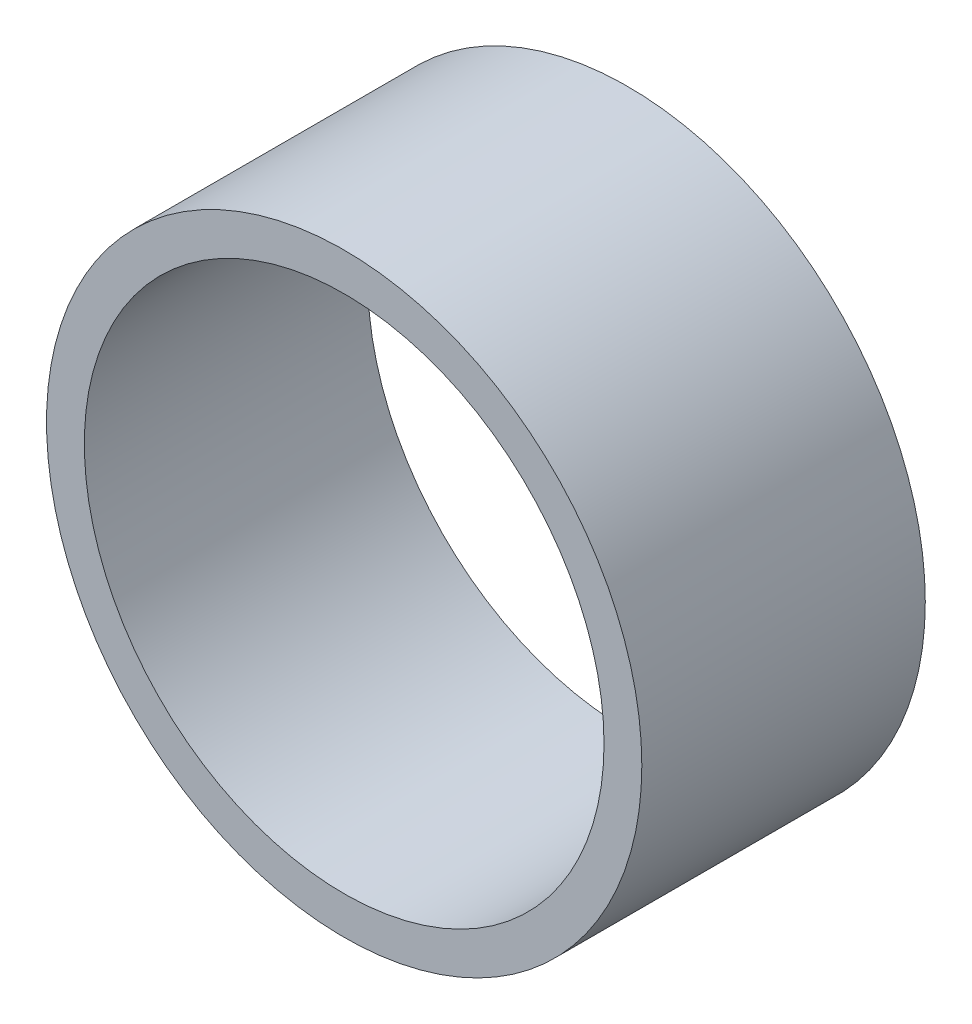
ISO-10303-21;
HEADER;
FILE_DESCRIPTION(('STEP AP214'),'2;1');
FILE_NAME('part.step','',(''),(''),'','','');
FILE_SCHEMA(('AUTOMOTIVE_DESIGN { 1 0 10303 214 1 1 1 1 }'));
ENDSEC;
DATA;
#1=APPLICATION_CONTEXT('core data for automotive mechanical design processes');
#2=APPLICATION_PROTOCOL_DEFINITION('international standard','automotive_design',2000,#1);
#3=PRODUCT_CONTEXT('',#1,'mechanical');
#4=PRODUCT('Part','Part','',(#3));
#5=PRODUCT_RELATED_PRODUCT_CATEGORY('part','',(#4));
#6=PRODUCT_DEFINITION_FORMATION('','',#4);
#7=PRODUCT_DEFINITION_CONTEXT('part definition',#1,'design');
#8=PRODUCT_DEFINITION('design','',#6,#7);
#9=PRODUCT_DEFINITION_SHAPE('','',#8);
#10=(LENGTH_UNIT() NAMED_UNIT(*) SI_UNIT(.MILLI.,.METRE.));
#11=(NAMED_UNIT(*) PLANE_ANGLE_UNIT() SI_UNIT($,.RADIAN.));
#12=(NAMED_UNIT(*) SI_UNIT($,.STERADIAN.) SOLID_ANGLE_UNIT());
#13=UNCERTAINTY_MEASURE_WITH_UNIT(LENGTH_MEASURE(1.E-05),#10,'distance_accuracy_value','');
#14=(GEOMETRIC_REPRESENTATION_CONTEXT(3) GLOBAL_UNCERTAINTY_ASSIGNED_CONTEXT((#13)) GLOBAL_UNIT_ASSIGNED_CONTEXT((#10,
#11,#12)) REPRESENTATION_CONTEXT('',''));
#15=CARTESIAN_POINT('',(0.,0.,0.));
#16=DIRECTION('',(0.,0.,1.));
#17=DIRECTION('',(1.,0.,0.));
#18=AXIS2_PLACEMENT_3D('',#15,#16,#17);
#19=CARTESIAN_POINT('',(0.,0.,3.));
#20=DIRECTION('',(0.,0.,1.));
#21=DIRECTION('',(1.,0.,0.));
#22=AXIS2_PLACEMENT_3D('',#19,#20,#21);
#23=PLANE('',#22);
#24=CARTESIAN_POINT('',(0.,0.,3.));
#25=DIRECTION('',(0.,0.,1.));
#26=DIRECTION('',(1.,0.,0.));
#27=AXIS2_PLACEMENT_3D('',#24,#25,#26);
#28=CIRCLE('',#27,3.15);
#29=CARTESIAN_POINT('',(3.15,0.,3.));
#30=VERTEX_POINT('',#29);
#31=EDGE_CURVE('E10',#30,#30,#28,.T.);
#32=ORIENTED_EDGE('',*,*,#31,.T.);
#33=EDGE_LOOP('',(#32));
#34=FACE_BOUND('',#33,.T.);
#35=CARTESIAN_POINT('',(0.,0.,3.));
#36=DIRECTION('',(0.,0.,1.));
#37=DIRECTION('',(1.,0.,0.));
#38=AXIS2_PLACEMENT_3D('',#35,#36,#37);
#39=CIRCLE('',#38,2.75);
#40=CARTESIAN_POINT('',(2.75,0.,3.));
#41=VERTEX_POINT('',#40);
#42=EDGE_CURVE('E50',#41,#41,#39,.T.);
#43=ORIENTED_EDGE('',*,*,#42,.F.);
#44=EDGE_LOOP('',(#43));
#45=FACE_BOUND('',#44,.T.);
#46=ADVANCED_FACE('F37',(#34,#45),#23,.T.);
#47=CARTESIAN_POINT('',(0.,0.,0.));
#48=DIRECTION('',(0.,0.,1.));
#49=DIRECTION('',(1.,0.,0.));
#50=AXIS2_PLACEMENT_3D('',#47,#48,#49);
#51=PLANE('',#50);
#52=CARTESIAN_POINT('',(0.,0.,0.));
#53=DIRECTION('',(0.,0.,1.));
#54=DIRECTION('',(1.,0.,0.));
#55=AXIS2_PLACEMENT_3D('',#52,#53,#54);
#56=CIRCLE('',#55,3.15);
#57=CARTESIAN_POINT('',(3.15,0.,0.));
#58=VERTEX_POINT('',#57);
#59=EDGE_CURVE('E41',#58,#58,#56,.T.);
#60=ORIENTED_EDGE('',*,*,#59,.F.);
#61=EDGE_LOOP('',(#60));
#62=FACE_BOUND('',#61,.T.);
#63=CARTESIAN_POINT('',(0.,0.,0.));
#64=DIRECTION('',(0.,0.,1.));
#65=DIRECTION('',(1.,0.,0.));
#66=AXIS2_PLACEMENT_3D('',#63,#64,#65);
#67=CIRCLE('',#66,2.75);
#68=CARTESIAN_POINT('',(2.75,0.,0.));
#69=VERTEX_POINT('',#68);
#70=EDGE_CURVE('E52',#69,#69,#67,.T.);
#71=ORIENTED_EDGE('',*,*,#70,.T.);
#72=EDGE_LOOP('',(#71));
#73=FACE_BOUND('',#72,.T.);
#74=ADVANCED_FACE('F64',(#62,#73),#51,.F.);
#75=CARTESIAN_POINT('',(0.,0.,3.));
#76=DIRECTION('',(0.,0.,-1.));
#77=DIRECTION('',(-1.,0.,0.));
#78=AXIS2_PLACEMENT_3D('',#75,#76,#77);
#79=CYLINDRICAL_SURFACE('',#78,3.15);
#80=ORIENTED_EDGE('',*,*,#31,.F.);
#81=EDGE_LOOP('',(#80));
#82=FACE_BOUND('',#81,.T.);
#83=ORIENTED_EDGE('',*,*,#59,.T.);
#84=EDGE_LOOP('',(#83));
#85=FACE_BOUND('',#84,.T.);
#86=ADVANCED_FACE('F39',(#82,#85),#79,.T.);
#87=CARTESIAN_POINT('',(0.,0.,3.));
#88=DIRECTION('',(0.,0.,-1.));
#89=DIRECTION('',(-1.,0.,0.));
#90=AXIS2_PLACEMENT_3D('',#87,#88,#89);
#91=CYLINDRICAL_SURFACE('',#90,2.75);
#92=ORIENTED_EDGE('',*,*,#42,.T.);
#93=EDGE_LOOP('',(#92));
#94=FACE_BOUND('',#93,.T.);
#95=ORIENTED_EDGE('',*,*,#70,.F.);
#96=EDGE_LOOP('',(#95));
#97=FACE_BOUND('',#96,.T.);
#98=ADVANCED_FACE('F60',(#94,#97),#91,.F.);
#99=CLOSED_SHELL('',(#46,#74,#86,#98));
#100=MANIFOLD_SOLID_BREP('B2',#99);
#101=ADVANCED_BREP_SHAPE_REPRESENTATION('',(#18,#100),#14);
#102=SHAPE_DEFINITION_REPRESENTATION(#9,#101);
ENDSEC;
END-ISO-10303-21;
